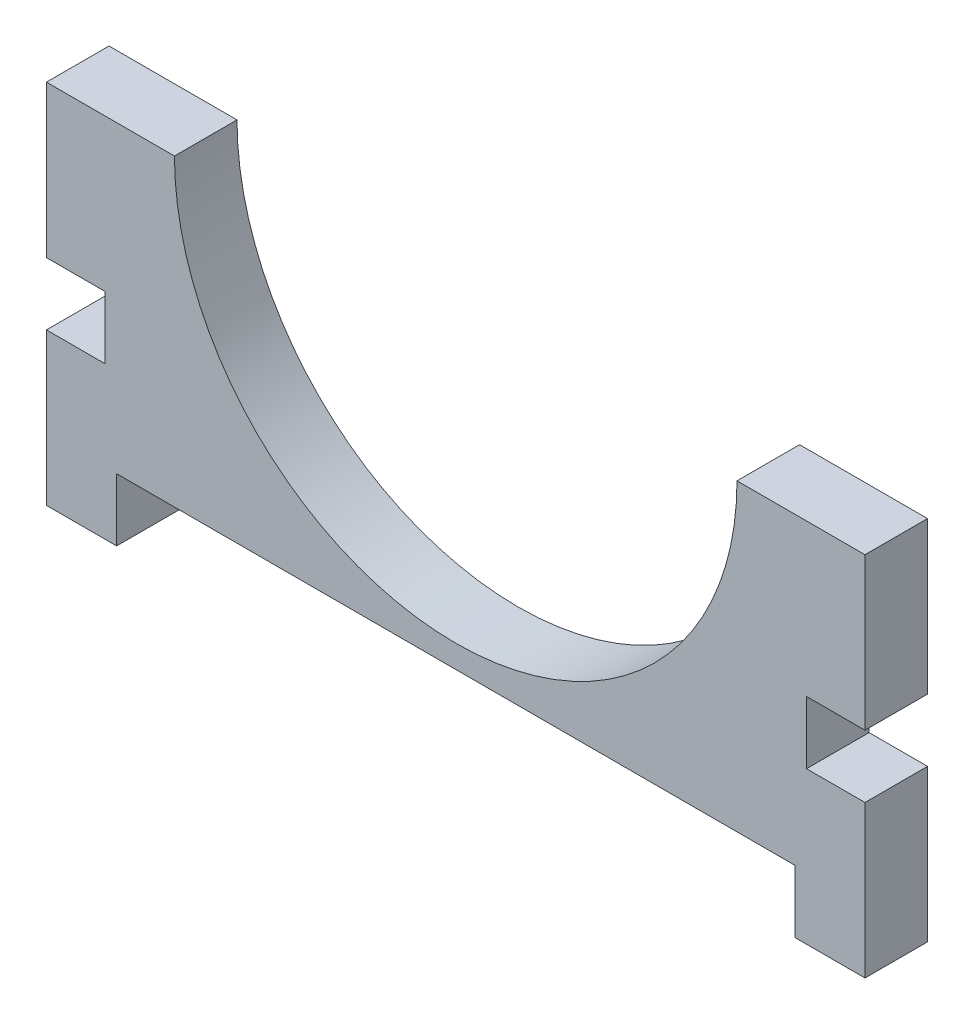
ISO-10303-21;
HEADER;
FILE_DESCRIPTION(('STEP AP214'),'2;1');
FILE_NAME('part.step','',(''),(''),'','','');
FILE_SCHEMA(('AUTOMOTIVE_DESIGN { 1 0 10303 214 1 1 1 1 }'));
ENDSEC;
DATA;
#1=APPLICATION_CONTEXT('core data for automotive mechanical design processes');
#2=APPLICATION_PROTOCOL_DEFINITION('international standard','automotive_design',2000,#1);
#3=PRODUCT_CONTEXT('',#1,'mechanical');
#4=PRODUCT('Part','Part','',(#3));
#5=PRODUCT_RELATED_PRODUCT_CATEGORY('part','',(#4));
#6=PRODUCT_DEFINITION_FORMATION('','',#4);
#7=PRODUCT_DEFINITION_CONTEXT('part definition',#1,'design');
#8=PRODUCT_DEFINITION('design','',#6,#7);
#9=PRODUCT_DEFINITION_SHAPE('','',#8);
#10=(LENGTH_UNIT() NAMED_UNIT(*) SI_UNIT(.MILLI.,.METRE.));
#11=(NAMED_UNIT(*) PLANE_ANGLE_UNIT() SI_UNIT($,.RADIAN.));
#12=(NAMED_UNIT(*) SI_UNIT($,.STERADIAN.) SOLID_ANGLE_UNIT());
#13=UNCERTAINTY_MEASURE_WITH_UNIT(LENGTH_MEASURE(1.E-05),#10,'distance_accuracy_value','');
#14=(GEOMETRIC_REPRESENTATION_CONTEXT(3) GLOBAL_UNCERTAINTY_ASSIGNED_CONTEXT((#13)) GLOBAL_UNIT_ASSIGNED_CONTEXT((#10,
#11,#12)) REPRESENTATION_CONTEXT('',''));
#15=CARTESIAN_POINT('',(0.,0.,0.));
#16=DIRECTION('',(0.,0.,1.));
#17=DIRECTION('',(1.,0.,0.));
#18=AXIS2_PLACEMENT_3D('',#15,#16,#17);
#19=CARTESIAN_POINT('',(-35.,-5.35,5.35));
#20=DIRECTION('',(0.,1.,0.));
#21=DIRECTION('',(0.,0.,1.));
#22=AXIS2_PLACEMENT_3D('',#19,#20,#21);
#23=PLANE('',#22);
#24=DIRECTION('',(1.,0.,0.));
#25=VECTOR('',#24,1.);
#26=CARTESIAN_POINT('',(-35.,-5.35,0.));
#27=LINE('',#26,#25);
#28=CARTESIAN_POINT('',(-35.,-5.35,0.));
#29=VERTEX_POINT('',#28);
#30=CARTESIAN_POINT('',(-29.,-5.35,0.));
#31=VERTEX_POINT('',#30);
#32=EDGE_CURVE('E193',#29,#31,#27,.T.);
#33=ORIENTED_EDGE('',*,*,#32,.T.);
#34=DIRECTION('',(0.,0.,-1.));
#35=VECTOR('',#34,1.);
#36=CARTESIAN_POINT('',(-29.,-5.35,5.35));
#37=LINE('',#36,#35);
#38=CARTESIAN_POINT('',(-29.,-5.35,5.35));
#39=VERTEX_POINT('',#38);
#40=EDGE_CURVE('E41',#39,#31,#37,.T.);
#41=ORIENTED_EDGE('',*,*,#40,.F.);
#42=DIRECTION('',(1.,0.,0.));
#43=VECTOR('',#42,1.);
#44=CARTESIAN_POINT('',(-35.,-5.35,5.35));
#45=LINE('',#44,#43);
#46=CARTESIAN_POINT('',(-35.,-5.35,5.35));
#47=VERTEX_POINT('',#46);
#48=EDGE_CURVE('E123',#47,#39,#45,.T.);
#49=ORIENTED_EDGE('',*,*,#48,.F.);
#50=DIRECTION('',(0.,0.,-1.));
#51=VECTOR('',#50,1.);
#52=CARTESIAN_POINT('',(-35.,-5.35,5.35));
#53=LINE('',#52,#51);
#54=EDGE_CURVE('E11',#47,#29,#53,.T.);
#55=ORIENTED_EDGE('',*,*,#54,.T.);
#56=EDGE_LOOP('',(#33,#41,#49,#55));
#57=FACE_BOUND('',#56,.T.);
#58=ADVANCED_FACE('F33',(#57),#23,.F.);
#59=CARTESIAN_POINT('',(-29.,0.,5.35));
#60=DIRECTION('',(-1.,0.,0.));
#61=DIRECTION('',(0.,0.,1.));
#62=AXIS2_PLACEMENT_3D('',#59,#60,#61);
#63=PLANE('',#62);
#64=DIRECTION('',(0.,1.,0.));
#65=VECTOR('',#64,1.);
#66=CARTESIAN_POINT('',(-29.,0.,0.));
#67=LINE('',#66,#65);
#68=CARTESIAN_POINT('',(-29.,0.,0.));
#69=VERTEX_POINT('',#68);
#70=EDGE_CURVE('E195',#31,#69,#67,.T.);
#71=ORIENTED_EDGE('',*,*,#70,.T.);
#72=DIRECTION('',(0.,0.,-1.));
#73=VECTOR('',#72,1.);
#74=CARTESIAN_POINT('',(-29.,0.,5.35));
#75=LINE('',#74,#73);
#76=CARTESIAN_POINT('',(-29.,0.,5.35));
#77=VERTEX_POINT('',#76);
#78=EDGE_CURVE('E263',#77,#69,#75,.T.);
#79=ORIENTED_EDGE('',*,*,#78,.F.);
#80=DIRECTION('',(0.,1.,0.));
#81=VECTOR('',#80,1.);
#82=CARTESIAN_POINT('',(-29.,0.,5.35));
#83=LINE('',#82,#81);
#84=EDGE_CURVE('E271',#39,#77,#83,.T.);
#85=ORIENTED_EDGE('',*,*,#84,.F.);
#86=ORIENTED_EDGE('',*,*,#40,.T.);
#87=EDGE_LOOP('',(#71,#79,#85,#86));
#88=FACE_BOUND('',#87,.T.);
#89=ADVANCED_FACE('F269',(#88),#63,.F.);
#90=CARTESIAN_POINT('',(-29.,0.,5.35));
#91=DIRECTION('',(0.,1.,0.));
#92=DIRECTION('',(0.,0.,1.));
#93=AXIS2_PLACEMENT_3D('',#90,#91,#92);
#94=PLANE('',#93);
#95=DIRECTION('',(1.,0.,0.));
#96=VECTOR('',#95,1.);
#97=CARTESIAN_POINT('',(-29.,0.,0.));
#98=LINE('',#97,#96);
#99=CARTESIAN_POINT('',(29.,0.,0.));
#100=VERTEX_POINT('',#99);
#101=EDGE_CURVE('E197',#69,#100,#98,.T.);
#102=ORIENTED_EDGE('',*,*,#101,.T.);
#103=DIRECTION('',(0.,0.,-1.));
#104=VECTOR('',#103,1.);
#105=CARTESIAN_POINT('',(29.,0.,5.35));
#106=LINE('',#105,#104);
#107=CARTESIAN_POINT('',(29.,0.,5.35));
#108=VERTEX_POINT('',#107);
#109=EDGE_CURVE('E260',#108,#100,#106,.T.);
#110=ORIENTED_EDGE('',*,*,#109,.F.);
#111=DIRECTION('',(1.,0.,0.));
#112=VECTOR('',#111,1.);
#113=CARTESIAN_POINT('',(-29.,0.,5.35));
#114=LINE('',#113,#112);
#115=EDGE_CURVE('E290',#77,#108,#114,.T.);
#116=ORIENTED_EDGE('',*,*,#115,.F.);
#117=ORIENTED_EDGE('',*,*,#78,.T.);
#118=EDGE_LOOP('',(#102,#110,#116,#117));
#119=FACE_BOUND('',#118,.T.);
#120=ADVANCED_FACE('F281',(#119),#94,.F.);
#121=CARTESIAN_POINT('',(29.,0.,5.35));
#122=DIRECTION('',(1.,0.,0.));
#123=DIRECTION('',(0.,0.,-1.));
#124=AXIS2_PLACEMENT_3D('',#121,#122,#123);
#125=PLANE('',#124);
#126=DIRECTION('',(0.,-1.,0.));
#127=VECTOR('',#126,1.);
#128=CARTESIAN_POINT('',(29.,0.,0.));
#129=LINE('',#128,#127);
#130=CARTESIAN_POINT('',(29.,-5.35,0.));
#131=VERTEX_POINT('',#130);
#132=EDGE_CURVE('E199',#100,#131,#129,.T.);
#133=ORIENTED_EDGE('',*,*,#132,.T.);
#134=DIRECTION('',(0.,0.,-1.));
#135=VECTOR('',#134,1.);
#136=CARTESIAN_POINT('',(29.,-5.35,5.35));
#137=LINE('',#136,#135);
#138=CARTESIAN_POINT('',(29.,-5.35,5.35));
#139=VERTEX_POINT('',#138);
#140=EDGE_CURVE('E257',#139,#131,#137,.T.);
#141=ORIENTED_EDGE('',*,*,#140,.F.);
#142=DIRECTION('',(0.,-1.,0.));
#143=VECTOR('',#142,1.);
#144=CARTESIAN_POINT('',(29.,0.,5.35));
#145=LINE('',#144,#143);
#146=EDGE_CURVE('E287',#108,#139,#145,.T.);
#147=ORIENTED_EDGE('',*,*,#146,.F.);
#148=ORIENTED_EDGE('',*,*,#109,.T.);
#149=EDGE_LOOP('',(#133,#141,#147,#148));
#150=FACE_BOUND('',#149,.T.);
#151=ADVANCED_FACE('F285',(#150),#125,.F.);
#152=CARTESIAN_POINT('',(35.,-5.35,5.35));
#153=DIRECTION('',(0.,1.,0.));
#154=DIRECTION('',(0.,0.,1.));
#155=AXIS2_PLACEMENT_3D('',#152,#153,#154);
#156=PLANE('',#155);
#157=DIRECTION('',(1.,0.,0.));
#158=VECTOR('',#157,1.);
#159=CARTESIAN_POINT('',(35.,-5.35,0.));
#160=LINE('',#159,#158);
#161=CARTESIAN_POINT('',(35.,-5.35,0.));
#162=VERTEX_POINT('',#161);
#163=EDGE_CURVE('E201',#131,#162,#160,.T.);
#164=ORIENTED_EDGE('',*,*,#163,.T.);
#165=DIRECTION('',(0.,0.,-1.));
#166=VECTOR('',#165,1.);
#167=CARTESIAN_POINT('',(35.,-5.35,5.35));
#168=LINE('',#167,#166);
#169=CARTESIAN_POINT('',(35.,-5.35,5.35));
#170=VERTEX_POINT('',#169);
#171=EDGE_CURVE('E254',#170,#162,#168,.T.);
#172=ORIENTED_EDGE('',*,*,#171,.F.);
#173=DIRECTION('',(1.,0.,0.));
#174=VECTOR('',#173,1.);
#175=CARTESIAN_POINT('',(35.,-5.35,5.35));
#176=LINE('',#175,#174);
#177=EDGE_CURVE('E289',#139,#170,#176,.T.);
#178=ORIENTED_EDGE('',*,*,#177,.F.);
#179=ORIENTED_EDGE('',*,*,#140,.T.);
#180=EDGE_LOOP('',(#164,#172,#178,#179));
#181=FACE_BOUND('',#180,.T.);
#182=ADVANCED_FACE('F344',(#181),#156,.F.);
#183=CARTESIAN_POINT('',(35.,-0.78449251647359,5.35));
#184=DIRECTION('',(-1.,0.,0.));
#185=DIRECTION('',(0.,0.,1.));
#186=AXIS2_PLACEMENT_3D('',#183,#184,#185);
#187=PLANE('',#186);
#188=DIRECTION('',(0.,1.,0.));
#189=VECTOR('',#188,1.);
#190=CARTESIAN_POINT('',(35.,-0.78449251647359,0.));
#191=LINE('',#190,#189);
#192=CARTESIAN_POINT('',(35.,7.65,0.));
#193=VERTEX_POINT('',#192);
#194=EDGE_CURVE('E204',#162,#193,#191,.T.);
#195=ORIENTED_EDGE('',*,*,#194,.T.);
#196=DIRECTION('',(0.,0.,-1.));
#197=VECTOR('',#196,1.);
#198=CARTESIAN_POINT('',(35.,7.65,5.35));
#199=LINE('',#198,#197);
#200=CARTESIAN_POINT('',(35.,7.65,5.35));
#201=VERTEX_POINT('',#200);
#202=EDGE_CURVE('E251',#201,#193,#199,.T.);
#203=ORIENTED_EDGE('',*,*,#202,.F.);
#204=DIRECTION('',(0.,1.,0.));
#205=VECTOR('',#204,1.);
#206=CARTESIAN_POINT('',(35.,-0.78449251647359,5.35));
#207=LINE('',#206,#205);
#208=EDGE_CURVE('E292',#170,#201,#207,.T.);
#209=ORIENTED_EDGE('',*,*,#208,.F.);
#210=ORIENTED_EDGE('',*,*,#171,.T.);
#211=EDGE_LOOP('',(#195,#203,#209,#210));
#212=FACE_BOUND('',#211,.T.);
#213=ADVANCED_FACE('F347',(#212),#187,.F.);
#214=CARTESIAN_POINT('',(35.,7.65,5.35));
#215=DIRECTION('',(0.,-1.,0.));
#216=DIRECTION('',(0.,0.,-1.));
#217=AXIS2_PLACEMENT_3D('',#214,#215,#216);
#218=PLANE('',#217);
#219=DIRECTION('',(-1.,0.,0.));
#220=VECTOR('',#219,1.);
#221=CARTESIAN_POINT('',(35.,7.65,0.));
#222=LINE('',#221,#220);
#223=CARTESIAN_POINT('',(30.,7.65,0.));
#224=VERTEX_POINT('',#223);
#225=EDGE_CURVE('E206',#193,#224,#222,.T.);
#226=ORIENTED_EDGE('',*,*,#225,.T.);
#227=DIRECTION('',(0.,0.,-1.));
#228=VECTOR('',#227,1.);
#229=CARTESIAN_POINT('',(30.,7.65,5.35));
#230=LINE('',#229,#228);
#231=CARTESIAN_POINT('',(30.,7.65,5.35));
#232=VERTEX_POINT('',#231);
#233=EDGE_CURVE('E248',#232,#224,#230,.T.);
#234=ORIENTED_EDGE('',*,*,#233,.F.);
#235=DIRECTION('',(-1.,0.,0.));
#236=VECTOR('',#235,1.);
#237=CARTESIAN_POINT('',(35.,7.65,5.35));
#238=LINE('',#237,#236);
#239=EDGE_CURVE('E298',#201,#232,#238,.T.);
#240=ORIENTED_EDGE('',*,*,#239,.F.);
#241=ORIENTED_EDGE('',*,*,#202,.T.);
#242=EDGE_LOOP('',(#226,#234,#240,#241));
#243=FACE_BOUND('',#242,.T.);
#244=ADVANCED_FACE('F351',(#243),#218,.F.);
#245=CARTESIAN_POINT('',(30.,13.,5.35));
#246=DIRECTION('',(-1.,0.,0.));
#247=DIRECTION('',(0.,-1.,0.));
#248=AXIS2_PLACEMENT_3D('',#245,#246,#247);
#249=PLANE('',#248);
#250=DIRECTION('',(0.,1.,0.));
#251=VECTOR('',#250,1.);
#252=CARTESIAN_POINT('',(30.,13.,0.));
#253=LINE('',#252,#251);
#254=CARTESIAN_POINT('',(30.,13.,0.));
#255=VERTEX_POINT('',#254);
#256=EDGE_CURVE('E208',#224,#255,#253,.T.);
#257=ORIENTED_EDGE('',*,*,#256,.T.);
#258=DIRECTION('',(0.,0.,-1.));
#259=VECTOR('',#258,1.);
#260=CARTESIAN_POINT('',(30.,13.,5.35));
#261=LINE('',#260,#259);
#262=CARTESIAN_POINT('',(30.,13.,5.35));
#263=VERTEX_POINT('',#262);
#264=EDGE_CURVE('E245',#263,#255,#261,.T.);
#265=ORIENTED_EDGE('',*,*,#264,.F.);
#266=DIRECTION('',(0.,1.,0.));
#267=VECTOR('',#266,1.);
#268=CARTESIAN_POINT('',(30.,13.,5.35));
#269=LINE('',#268,#267);
#270=EDGE_CURVE('E300',#232,#263,#269,.T.);
#271=ORIENTED_EDGE('',*,*,#270,.F.);
#272=ORIENTED_EDGE('',*,*,#233,.T.);
#273=EDGE_LOOP('',(#257,#265,#271,#272));
#274=FACE_BOUND('',#273,.T.);
#275=ADVANCED_FACE('F355',(#274),#249,.F.);
#276=CARTESIAN_POINT('',(35.,13.,5.35));
#277=DIRECTION('',(0.,1.,0.));
#278=DIRECTION('',(0.,0.,1.));
#279=AXIS2_PLACEMENT_3D('',#276,#277,#278);
#280=PLANE('',#279);
#281=DIRECTION('',(1.,0.,0.));
#282=VECTOR('',#281,1.);
#283=CARTESIAN_POINT('',(35.,13.,0.));
#284=LINE('',#283,#282);
#285=CARTESIAN_POINT('',(35.,13.,0.));
#286=VERTEX_POINT('',#285);
#287=EDGE_CURVE('E210',#255,#286,#284,.T.);
#288=ORIENTED_EDGE('',*,*,#287,.T.);
#289=DIRECTION('',(0.,0.,-1.));
#290=VECTOR('',#289,1.);
#291=CARTESIAN_POINT('',(35.,13.,5.35));
#292=LINE('',#291,#290);
#293=CARTESIAN_POINT('',(35.,13.,5.35));
#294=VERTEX_POINT('',#293);
#295=EDGE_CURVE('E242',#294,#286,#292,.T.);
#296=ORIENTED_EDGE('',*,*,#295,.F.);
#297=DIRECTION('',(1.,0.,0.));
#298=VECTOR('',#297,1.);
#299=CARTESIAN_POINT('',(35.,13.,5.35));
#300=LINE('',#299,#298);
#301=EDGE_CURVE('E302',#263,#294,#300,.T.);
#302=ORIENTED_EDGE('',*,*,#301,.F.);
#303=ORIENTED_EDGE('',*,*,#264,.T.);
#304=EDGE_LOOP('',(#288,#296,#302,#303));
#305=FACE_BOUND('',#304,.T.);
#306=ADVANCED_FACE('F359',(#305),#280,.F.);
#307=CARTESIAN_POINT('',(35.,13.,5.35));
#308=DIRECTION('',(-1.,0.,0.));
#309=DIRECTION('',(0.,0.,1.));
#310=AXIS2_PLACEMENT_3D('',#307,#308,#309);
#311=PLANE('',#310);
#312=DIRECTION('',(0.,1.,0.));
#313=VECTOR('',#312,1.);
#314=CARTESIAN_POINT('',(35.,13.,0.));
#315=LINE('',#314,#313);
#316=CARTESIAN_POINT('',(35.,26.,0.));
#317=VERTEX_POINT('',#316);
#318=EDGE_CURVE('E212',#286,#317,#315,.T.);
#319=ORIENTED_EDGE('',*,*,#318,.T.);
#320=DIRECTION('',(0.,0.,-1.));
#321=VECTOR('',#320,1.);
#322=CARTESIAN_POINT('',(35.,26.,5.35));
#323=LINE('',#322,#321);
#324=CARTESIAN_POINT('',(35.,26.,5.35));
#325=VERTEX_POINT('',#324);
#326=EDGE_CURVE('E239',#325,#317,#323,.T.);
#327=ORIENTED_EDGE('',*,*,#326,.F.);
#328=DIRECTION('',(0.,1.,0.));
#329=VECTOR('',#328,1.);
#330=CARTESIAN_POINT('',(35.,13.,5.35));
#331=LINE('',#330,#329);
#332=EDGE_CURVE('E304',#294,#325,#331,.T.);
#333=ORIENTED_EDGE('',*,*,#332,.F.);
#334=ORIENTED_EDGE('',*,*,#295,.T.);
#335=EDGE_LOOP('',(#319,#327,#333,#334));
#336=FACE_BOUND('',#335,.T.);
#337=ADVANCED_FACE('F363',(#336),#311,.F.);
#338=CARTESIAN_POINT('',(24.055,26.,5.35));
#339=DIRECTION('',(0.,-1.,0.));
#340=DIRECTION('',(0.,0.,-1.));
#341=AXIS2_PLACEMENT_3D('',#338,#339,#340);
#342=PLANE('',#341);
#343=DIRECTION('',(-1.,0.,0.));
#344=VECTOR('',#343,1.);
#345=CARTESIAN_POINT('',(24.055,26.,0.));
#346=LINE('',#345,#344);
#347=CARTESIAN_POINT('',(24.055,26.,0.));
#348=VERTEX_POINT('',#347);
#349=EDGE_CURVE('E214',#317,#348,#346,.T.);
#350=ORIENTED_EDGE('',*,*,#349,.T.);
#351=DIRECTION('',(0.,0.,-1.));
#352=VECTOR('',#351,1.);
#353=CARTESIAN_POINT('',(24.055,26.,5.35));
#354=LINE('',#353,#352);
#355=CARTESIAN_POINT('',(24.055,26.,5.35));
#356=VERTEX_POINT('',#355);
#357=EDGE_CURVE('E236',#356,#348,#354,.T.);
#358=ORIENTED_EDGE('',*,*,#357,.F.);
#359=DIRECTION('',(-1.,0.,0.));
#360=VECTOR('',#359,1.);
#361=CARTESIAN_POINT('',(24.055,26.,5.35));
#362=LINE('',#361,#360);
#363=EDGE_CURVE('E306',#325,#356,#362,.T.);
#364=ORIENTED_EDGE('',*,*,#363,.F.);
#365=ORIENTED_EDGE('',*,*,#326,.T.);
#366=EDGE_LOOP('',(#350,#358,#364,#365));
#367=FACE_BOUND('',#366,.T.);
#368=ADVANCED_FACE('F367',(#367),#342,.F.);
#369=CARTESIAN_POINT('',(0.,26.,5.35));
#370=DIRECTION('',(0.,0.,-1.));
#371=DIRECTION('',(-1.,0.,0.));
#372=AXIS2_PLACEMENT_3D('',#369,#370,#371);
#373=CYLINDRICAL_SURFACE('',#372,24.055);
#374=CARTESIAN_POINT('',(0.,26.,0.));
#375=DIRECTION('',(0.,0.,-1.));
#376=DIRECTION('',(1.,0.,0.));
#377=AXIS2_PLACEMENT_3D('',#374,#375,#376);
#378=CIRCLE('',#377,24.055);
#379=CARTESIAN_POINT('',(-24.055,26.,0.));
#380=VERTEX_POINT('',#379);
#381=EDGE_CURVE('E216',#348,#380,#378,.T.);
#382=ORIENTED_EDGE('',*,*,#381,.T.);
#383=DIRECTION('',(0.,0.,-1.));
#384=VECTOR('',#383,1.);
#385=CARTESIAN_POINT('',(-24.055,26.,5.35));
#386=LINE('',#385,#384);
#387=CARTESIAN_POINT('',(-24.055,26.,5.35));
#388=VERTEX_POINT('',#387);
#389=EDGE_CURVE('E233',#388,#380,#386,.T.);
#390=ORIENTED_EDGE('',*,*,#389,.F.);
#391=CARTESIAN_POINT('',(0.,26.,5.35));
#392=DIRECTION('',(0.,0.,-1.));
#393=DIRECTION('',(1.,0.,0.));
#394=AXIS2_PLACEMENT_3D('',#391,#392,#393);
#395=CIRCLE('',#394,24.055);
#396=EDGE_CURVE('E308',#356,#388,#395,.T.);
#397=ORIENTED_EDGE('',*,*,#396,.F.);
#398=ORIENTED_EDGE('',*,*,#357,.T.);
#399=EDGE_LOOP('',(#382,#390,#397,#398));
#400=FACE_BOUND('',#399,.T.);
#401=ADVANCED_FACE('F371',(#400),#373,.F.);
#402=CARTESIAN_POINT('',(-35.,26.,5.35));
#403=DIRECTION('',(0.,-1.,0.));
#404=DIRECTION('',(0.,0.,-1.));
#405=AXIS2_PLACEMENT_3D('',#402,#403,#404);
#406=PLANE('',#405);
#407=DIRECTION('',(-1.,0.,0.));
#408=VECTOR('',#407,1.);
#409=CARTESIAN_POINT('',(-35.,26.,0.));
#410=LINE('',#409,#408);
#411=CARTESIAN_POINT('',(-35.,26.,0.));
#412=VERTEX_POINT('',#411);
#413=EDGE_CURVE('E218',#380,#412,#410,.T.);
#414=ORIENTED_EDGE('',*,*,#413,.T.);
#415=DIRECTION('',(0.,0.,-1.));
#416=VECTOR('',#415,1.);
#417=CARTESIAN_POINT('',(-35.,26.,5.35));
#418=LINE('',#417,#416);
#419=CARTESIAN_POINT('',(-35.,26.,5.35));
#420=VERTEX_POINT('',#419);
#421=EDGE_CURVE('E230',#420,#412,#418,.T.);
#422=ORIENTED_EDGE('',*,*,#421,.F.);
#423=DIRECTION('',(-1.,0.,0.));
#424=VECTOR('',#423,1.);
#425=CARTESIAN_POINT('',(-35.,26.,5.35));
#426=LINE('',#425,#424);
#427=EDGE_CURVE('E310',#388,#420,#426,.T.);
#428=ORIENTED_EDGE('',*,*,#427,.F.);
#429=ORIENTED_EDGE('',*,*,#389,.T.);
#430=EDGE_LOOP('',(#414,#422,#428,#429));
#431=FACE_BOUND('',#430,.T.);
#432=ADVANCED_FACE('F316',(#431),#406,.F.);
#433=CARTESIAN_POINT('',(-35.,13.,5.35));
#434=DIRECTION('',(1.,0.,0.));
#435=DIRECTION('',(0.,0.,-1.));
#436=AXIS2_PLACEMENT_3D('',#433,#434,#435);
#437=PLANE('',#436);
#438=DIRECTION('',(0.,-1.,0.));
#439=VECTOR('',#438,1.);
#440=CARTESIAN_POINT('',(-35.,13.,0.));
#441=LINE('',#440,#439);
#442=CARTESIAN_POINT('',(-35.,13.,0.));
#443=VERTEX_POINT('',#442);
#444=EDGE_CURVE('E220',#412,#443,#441,.T.);
#445=ORIENTED_EDGE('',*,*,#444,.T.);
#446=DIRECTION('',(0.,0.,-1.));
#447=VECTOR('',#446,1.);
#448=CARTESIAN_POINT('',(-35.,13.,5.35));
#449=LINE('',#448,#447);
#450=CARTESIAN_POINT('',(-35.,13.,5.35));
#451=VERTEX_POINT('',#450);
#452=EDGE_CURVE('E182',#451,#443,#449,.T.);
#453=ORIENTED_EDGE('',*,*,#452,.F.);
#454=DIRECTION('',(0.,-1.,0.));
#455=VECTOR('',#454,1.);
#456=CARTESIAN_POINT('',(-35.,13.,5.35));
#457=LINE('',#456,#455);
#458=EDGE_CURVE('E173',#420,#451,#457,.T.);
#459=ORIENTED_EDGE('',*,*,#458,.F.);
#460=ORIENTED_EDGE('',*,*,#421,.T.);
#461=EDGE_LOOP('',(#445,#453,#459,#460));
#462=FACE_BOUND('',#461,.T.);
#463=ADVANCED_FACE('F320',(#462),#437,.F.);
#464=CARTESIAN_POINT('',(-35.,13.,5.35));
#465=DIRECTION('',(0.,1.,0.));
#466=DIRECTION('',(0.,0.,1.));
#467=AXIS2_PLACEMENT_3D('',#464,#465,#466);
#468=PLANE('',#467);
#469=DIRECTION('',(1.,0.,0.));
#470=VECTOR('',#469,1.);
#471=CARTESIAN_POINT('',(-35.,13.,0.));
#472=LINE('',#471,#470);
#473=CARTESIAN_POINT('',(-30.,13.,0.));
#474=VERTEX_POINT('',#473);
#475=EDGE_CURVE('E181',#443,#474,#472,.T.);
#476=ORIENTED_EDGE('',*,*,#475,.T.);
#477=DIRECTION('',(0.,0.,-1.));
#478=VECTOR('',#477,1.);
#479=CARTESIAN_POINT('',(-30.,13.,5.35));
#480=LINE('',#479,#478);
#481=CARTESIAN_POINT('',(-30.,13.,5.35));
#482=VERTEX_POINT('',#481);
#483=EDGE_CURVE('E178',#482,#474,#480,.T.);
#484=ORIENTED_EDGE('',*,*,#483,.F.);
#485=DIRECTION('',(1.,0.,0.));
#486=VECTOR('',#485,1.);
#487=CARTESIAN_POINT('',(-35.,13.,5.35));
#488=LINE('',#487,#486);
#489=EDGE_CURVE('E167',#451,#482,#488,.T.);
#490=ORIENTED_EDGE('',*,*,#489,.F.);
#491=ORIENTED_EDGE('',*,*,#452,.T.);
#492=EDGE_LOOP('',(#476,#484,#490,#491));
#493=FACE_BOUND('',#492,.T.);
#494=ADVANCED_FACE('F179',(#493),#468,.F.);
#495=CARTESIAN_POINT('',(-30.,13.,5.35));
#496=DIRECTION('',(1.,0.,0.));
#497=DIRECTION('',(0.,1.,0.));
#498=AXIS2_PLACEMENT_3D('',#495,#496,#497);
#499=PLANE('',#498);
#500=DIRECTION('',(0.,-1.,0.));
#501=VECTOR('',#500,1.);
#502=CARTESIAN_POINT('',(-30.,13.,0.));
#503=LINE('',#502,#501);
#504=CARTESIAN_POINT('',(-30.,7.65,0.));
#505=VERTEX_POINT('',#504);
#506=EDGE_CURVE('E109',#474,#505,#503,.T.);
#507=ORIENTED_EDGE('',*,*,#506,.T.);
#508=DIRECTION('',(0.,0.,-1.));
#509=VECTOR('',#508,1.);
#510=CARTESIAN_POINT('',(-30.,7.65,5.35));
#511=LINE('',#510,#509);
#512=CARTESIAN_POINT('',(-30.,7.65,5.35));
#513=VERTEX_POINT('',#512);
#514=EDGE_CURVE('E183',#513,#505,#511,.T.);
#515=ORIENTED_EDGE('',*,*,#514,.F.);
#516=DIRECTION('',(0.,-1.,0.));
#517=VECTOR('',#516,1.);
#518=CARTESIAN_POINT('',(-30.,13.,5.35));
#519=LINE('',#518,#517);
#520=EDGE_CURVE('E171',#482,#513,#519,.T.);
#521=ORIENTED_EDGE('',*,*,#520,.F.);
#522=ORIENTED_EDGE('',*,*,#483,.T.);
#523=EDGE_LOOP('',(#507,#515,#521,#522));
#524=FACE_BOUND('',#523,.T.);
#525=ADVANCED_FACE('F185',(#524),#499,.F.);
#526=CARTESIAN_POINT('',(-35.,7.65,5.35));
#527=DIRECTION('',(0.,-1.,0.));
#528=DIRECTION('',(0.,0.,-1.));
#529=AXIS2_PLACEMENT_3D('',#526,#527,#528);
#530=PLANE('',#529);
#531=DIRECTION('',(-1.,0.,0.));
#532=VECTOR('',#531,1.);
#533=CARTESIAN_POINT('',(-35.,7.65,0.));
#534=LINE('',#533,#532);
#535=CARTESIAN_POINT('',(-35.,7.65,0.));
#536=VERTEX_POINT('',#535);
#537=EDGE_CURVE('E116',#505,#536,#534,.T.);
#538=ORIENTED_EDGE('',*,*,#537,.T.);
#539=DIRECTION('',(0.,0.,-1.));
#540=VECTOR('',#539,1.);
#541=CARTESIAN_POINT('',(-35.,7.65,5.35));
#542=LINE('',#541,#540);
#543=CARTESIAN_POINT('',(-35.,7.65,5.35));
#544=VERTEX_POINT('',#543);
#545=EDGE_CURVE('E189',#544,#536,#542,.T.);
#546=ORIENTED_EDGE('',*,*,#545,.F.);
#547=DIRECTION('',(-1.,0.,0.));
#548=VECTOR('',#547,1.);
#549=CARTESIAN_POINT('',(-35.,7.65,5.35));
#550=LINE('',#549,#548);
#551=EDGE_CURVE('E187',#513,#544,#550,.T.);
#552=ORIENTED_EDGE('',*,*,#551,.F.);
#553=ORIENTED_EDGE('',*,*,#514,.T.);
#554=EDGE_LOOP('',(#538,#546,#552,#553));
#555=FACE_BOUND('',#554,.T.);
#556=ADVANCED_FACE('F322',(#555),#530,.F.);
#557=CARTESIAN_POINT('',(-35.,-0.78449251647359,5.35));
#558=DIRECTION('',(1.,0.,0.));
#559=DIRECTION('',(0.,0.,-1.));
#560=AXIS2_PLACEMENT_3D('',#557,#558,#559);
#561=PLANE('',#560);
#562=DIRECTION('',(0.,-1.,0.));
#563=VECTOR('',#562,1.);
#564=CARTESIAN_POINT('',(-35.,-0.78449251647359,0.));
#565=LINE('',#564,#563);
#566=EDGE_CURVE('E225',#536,#29,#565,.T.);
#567=ORIENTED_EDGE('',*,*,#566,.T.);
#568=ORIENTED_EDGE('',*,*,#54,.F.);
#569=DIRECTION('',(0.,-1.,0.));
#570=VECTOR('',#569,1.);
#571=CARTESIAN_POINT('',(-35.,-0.78449251647359,5.35));
#572=LINE('',#571,#570);
#573=EDGE_CURVE('E49',#544,#47,#572,.T.);
#574=ORIENTED_EDGE('',*,*,#573,.F.);
#575=ORIENTED_EDGE('',*,*,#545,.T.);
#576=EDGE_LOOP('',(#567,#568,#574,#575));
#577=FACE_BOUND('',#576,.T.);
#578=ADVANCED_FACE('F321',(#577),#561,.F.);
#579=CARTESIAN_POINT('',(0.,26.,5.35));
#580=DIRECTION('',(0.,0.,1.));
#581=DIRECTION('',(1.,0.,0.));
#582=AXIS2_PLACEMENT_3D('',#579,#580,#581);
#583=PLANE('',#582);
#584=ORIENTED_EDGE('',*,*,#573,.T.);
#585=ORIENTED_EDGE('',*,*,#48,.T.);
#586=ORIENTED_EDGE('',*,*,#84,.T.);
#587=ORIENTED_EDGE('',*,*,#115,.T.);
#588=ORIENTED_EDGE('',*,*,#146,.T.);
#589=ORIENTED_EDGE('',*,*,#177,.T.);
#590=ORIENTED_EDGE('',*,*,#208,.T.);
#591=ORIENTED_EDGE('',*,*,#239,.T.);
#592=ORIENTED_EDGE('',*,*,#270,.T.);
#593=ORIENTED_EDGE('',*,*,#301,.T.);
#594=ORIENTED_EDGE('',*,*,#332,.T.);
#595=ORIENTED_EDGE('',*,*,#363,.T.);
#596=ORIENTED_EDGE('',*,*,#396,.T.);
#597=ORIENTED_EDGE('',*,*,#427,.T.);
#598=ORIENTED_EDGE('',*,*,#458,.T.);
#599=ORIENTED_EDGE('',*,*,#489,.T.);
#600=ORIENTED_EDGE('',*,*,#520,.T.);
#601=ORIENTED_EDGE('',*,*,#551,.T.);
#602=EDGE_LOOP('',(#584,#585,#586,#587,#588,#589,#590,#591,#592,#593,#594,#595,#596,#597,#598,
#599,#600,#601));
#603=FACE_BOUND('',#602,.T.);
#604=ADVANCED_FACE('F169',(#603),#583,.T.);
#605=CARTESIAN_POINT('',(0.,26.,0.));
#606=DIRECTION('',(0.,0.,1.));
#607=DIRECTION('',(1.,0.,0.));
#608=AXIS2_PLACEMENT_3D('',#605,#606,#607);
#609=PLANE('',#608);
#610=ORIENTED_EDGE('',*,*,#32,.F.);
#611=ORIENTED_EDGE('',*,*,#566,.F.);
#612=ORIENTED_EDGE('',*,*,#537,.F.);
#613=ORIENTED_EDGE('',*,*,#506,.F.);
#614=ORIENTED_EDGE('',*,*,#475,.F.);
#615=ORIENTED_EDGE('',*,*,#444,.F.);
#616=ORIENTED_EDGE('',*,*,#413,.F.);
#617=ORIENTED_EDGE('',*,*,#381,.F.);
#618=ORIENTED_EDGE('',*,*,#349,.F.);
#619=ORIENTED_EDGE('',*,*,#318,.F.);
#620=ORIENTED_EDGE('',*,*,#287,.F.);
#621=ORIENTED_EDGE('',*,*,#256,.F.);
#622=ORIENTED_EDGE('',*,*,#225,.F.);
#623=ORIENTED_EDGE('',*,*,#194,.F.);
#624=ORIENTED_EDGE('',*,*,#163,.F.);
#625=ORIENTED_EDGE('',*,*,#132,.F.);
#626=ORIENTED_EDGE('',*,*,#101,.F.);
#627=ORIENTED_EDGE('',*,*,#70,.F.);
#628=EDGE_LOOP('',(#610,#611,#612,#613,#614,#615,#616,#617,#618,#619,#620,#621,#622,#623,#624,
#625,#626,#627));
#629=FACE_BOUND('',#628,.T.);
#630=ADVANCED_FACE('F275',(#629),#609,.F.);
#631=CLOSED_SHELL('',(#58,#89,#120,#151,#182,#213,#244,#275,#306,#337,#368,#401,#432,#463,#494,
#525,#556,#578,#604,#630));
#632=MANIFOLD_SOLID_BREP('B2',#631);
#633=ADVANCED_BREP_SHAPE_REPRESENTATION('',(#18,#632),#14);
#634=SHAPE_DEFINITION_REPRESENTATION(#9,#633);
ENDSEC;
END-ISO-10303-21;
